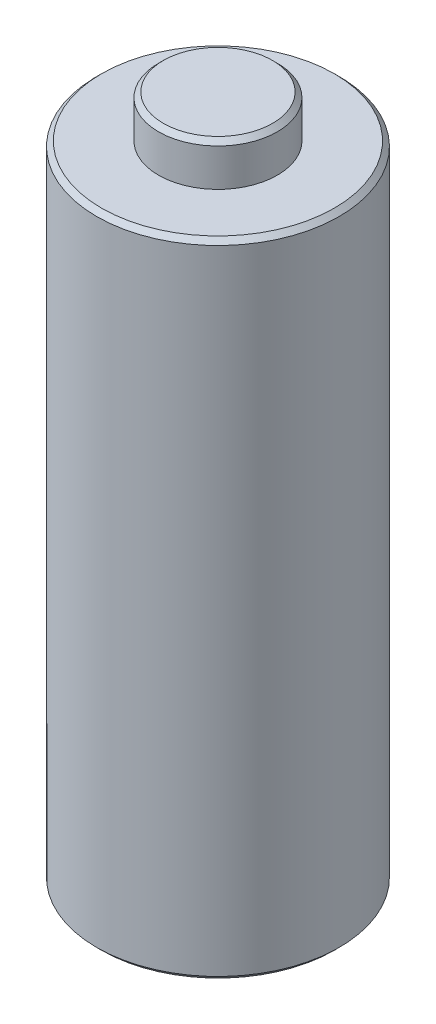
ISO-10303-21;
HEADER;
FILE_DESCRIPTION(('STEP AP214'),'2;1');
FILE_NAME('part.step','',(''),(''),'','','');
FILE_SCHEMA(('AUTOMOTIVE_DESIGN { 1 0 10303 214 1 1 1 1 }'));
ENDSEC;
DATA;
#1=APPLICATION_CONTEXT('core data for automotive mechanical design processes');
#2=APPLICATION_PROTOCOL_DEFINITION('international standard','automotive_design',2000,#1);
#3=PRODUCT_CONTEXT('',#1,'mechanical');
#4=PRODUCT('Part','Part','',(#3));
#5=PRODUCT_RELATED_PRODUCT_CATEGORY('part','',(#4));
#6=PRODUCT_DEFINITION_FORMATION('','',#4);
#7=PRODUCT_DEFINITION_CONTEXT('part definition',#1,'design');
#8=PRODUCT_DEFINITION('design','',#6,#7);
#9=PRODUCT_DEFINITION_SHAPE('','',#8);
#10=(LENGTH_UNIT() NAMED_UNIT(*) SI_UNIT(.MILLI.,.METRE.));
#11=(NAMED_UNIT(*) PLANE_ANGLE_UNIT() SI_UNIT($,.RADIAN.));
#12=(NAMED_UNIT(*) SI_UNIT($,.STERADIAN.) SOLID_ANGLE_UNIT());
#13=UNCERTAINTY_MEASURE_WITH_UNIT(LENGTH_MEASURE(1.E-05),#10,'distance_accuracy_value','');
#14=(GEOMETRIC_REPRESENTATION_CONTEXT(3) GLOBAL_UNCERTAINTY_ASSIGNED_CONTEXT((#13)) GLOBAL_UNIT_ASSIGNED_CONTEXT((#10,
#11,#12)) REPRESENTATION_CONTEXT('',''));
#15=CARTESIAN_POINT('',(0.,0.,0.));
#16=DIRECTION('',(0.,0.,1.));
#17=DIRECTION('',(1.,0.,0.));
#18=AXIS2_PLACEMENT_3D('',#15,#16,#17);
#19=CARTESIAN_POINT('',(0.,30.,0.));
#20=DIRECTION('',(0.,-1.,0.));
#21=DIRECTION('',(0.,0.,-1.));
#22=AXIS2_PLACEMENT_3D('',#19,#20,#21);
#23=CYLINDRICAL_SURFACE('',#22,2.45);
#24=CARTESIAN_POINT('',(0.,28.25,0.));
#25=DIRECTION('',(0.,1.,0.));
#26=DIRECTION('',(0.,0.,1.));
#27=AXIS2_PLACEMENT_3D('',#24,#25,#26);
#28=CIRCLE('',#27,2.45);
#29=CARTESIAN_POINT('',(0.,28.25,2.45));
#30=VERTEX_POINT('',#29);
#31=EDGE_CURVE('E62',#30,#30,#28,.T.);
#32=ORIENTED_EDGE('',*,*,#31,.T.);
#33=EDGE_LOOP('',(#32));
#34=FACE_BOUND('',#33,.T.);
#35=CARTESIAN_POINT('',(0.,29.8,0.));
#36=DIRECTION('',(0.,1.,0.));
#37=DIRECTION('',(0.,0.,1.));
#38=AXIS2_PLACEMENT_3D('',#35,#36,#37);
#39=CIRCLE('',#38,2.45);
#40=CARTESIAN_POINT('',(0.,29.8,2.45));
#41=VERTEX_POINT('',#40);
#42=EDGE_CURVE('E74',#41,#41,#39,.F.);
#43=ORIENTED_EDGE('',*,*,#42,.T.);
#44=EDGE_LOOP('',(#43));
#45=FACE_BOUND('',#44,.T.);
#46=ADVANCED_FACE('F43',(#34,#45),#23,.T.);
#47=CARTESIAN_POINT('',(0.,30.,0.));
#48=DIRECTION('',(0.,1.,0.));
#49=DIRECTION('',(0.,0.,1.));
#50=AXIS2_PLACEMENT_3D('',#47,#48,#49);
#51=PLANE('',#50);
#52=CARTESIAN_POINT('',(0.,30.,0.));
#53=DIRECTION('',(0.,1.,0.));
#54=DIRECTION('',(0.,0.,1.));
#55=AXIS2_PLACEMENT_3D('',#52,#53,#54);
#56=CIRCLE('',#55,2.25);
#57=CARTESIAN_POINT('',(0.,30.,2.25));
#58=VERTEX_POINT('',#57);
#59=EDGE_CURVE('E70',#58,#58,#56,.T.);
#60=ORIENTED_EDGE('',*,*,#59,.T.);
#61=EDGE_LOOP('',(#60));
#62=FACE_BOUND('',#61,.T.);
#63=ADVANCED_FACE('F85',(#62),#51,.T.);
#64=CARTESIAN_POINT('',(0.,30.,0.));
#65=DIRECTION('',(0.,-1.,0.));
#66=DIRECTION('',(0.,0.,-1.));
#67=AXIS2_PLACEMENT_3D('',#64,#65,#66);
#68=CONICAL_SURFACE('',#67,2.25,0.785398163397448);
#69=ORIENTED_EDGE('',*,*,#42,.F.);
#70=EDGE_LOOP('',(#69));
#71=FACE_BOUND('',#70,.T.);
#72=ORIENTED_EDGE('',*,*,#59,.F.);
#73=EDGE_LOOP('',(#72));
#74=FACE_BOUND('',#73,.T.);
#75=ADVANCED_FACE('F82',(#71,#74),#68,.T.);
#76=CARTESIAN_POINT('',(0.,28.25,0.));
#77=DIRECTION('',(0.,-1.,0.));
#78=DIRECTION('',(0.,0.,-1.));
#79=AXIS2_PLACEMENT_3D('',#76,#77,#78);
#80=CYLINDRICAL_SURFACE('',#79,5.);
#81=CARTESIAN_POINT('',(0.,1.95,0.));
#82=DIRECTION('',(0.,1.,0.));
#83=DIRECTION('',(0.,0.,1.));
#84=AXIS2_PLACEMENT_3D('',#81,#82,#83);
#85=CIRCLE('',#84,5.);
#86=CARTESIAN_POINT('',(0.,1.95,5.));
#87=VERTEX_POINT('',#86);
#88=EDGE_CURVE('E54',#87,#87,#85,.T.);
#89=ORIENTED_EDGE('',*,*,#88,.T.);
#90=EDGE_LOOP('',(#89));
#91=FACE_BOUND('',#90,.T.);
#92=CARTESIAN_POINT('',(0.,28.05,0.));
#93=DIRECTION('',(0.,1.,0.));
#94=DIRECTION('',(0.,0.,1.));
#95=AXIS2_PLACEMENT_3D('',#92,#93,#94);
#96=CIRCLE('',#95,5.);
#97=CARTESIAN_POINT('',(0.,28.05,5.));
#98=VERTEX_POINT('',#97);
#99=EDGE_CURVE('E56',#98,#98,#96,.F.);
#100=ORIENTED_EDGE('',*,*,#99,.T.);
#101=EDGE_LOOP('',(#100));
#102=FACE_BOUND('',#101,.T.);
#103=ADVANCED_FACE('F87',(#91,#102),#80,.T.);
#104=CARTESIAN_POINT('',(0.,28.25,0.));
#105=DIRECTION('',(0.,1.,0.));
#106=DIRECTION('',(0.,0.,1.));
#107=AXIS2_PLACEMENT_3D('',#104,#105,#106);
#108=PLANE('',#107);
#109=CARTESIAN_POINT('',(0.,28.25,0.));
#110=DIRECTION('',(0.,1.,0.));
#111=DIRECTION('',(0.,0.,1.));
#112=AXIS2_PLACEMENT_3D('',#109,#110,#111);
#113=CIRCLE('',#112,4.8);
#114=CARTESIAN_POINT('',(0.,28.25,4.8));
#115=VERTEX_POINT('',#114);
#116=EDGE_CURVE('E10',#115,#115,#113,.T.);
#117=ORIENTED_EDGE('',*,*,#116,.T.);
#118=EDGE_LOOP('',(#117));
#119=FACE_BOUND('',#118,.T.);
#120=ORIENTED_EDGE('',*,*,#31,.F.);
#121=EDGE_LOOP('',(#120));
#122=FACE_BOUND('',#121,.T.);
#123=ADVANCED_FACE('F92',(#119,#122),#108,.T.);
#124=CARTESIAN_POINT('',(0.,1.75,0.));
#125=DIRECTION('',(0.,1.,0.));
#126=DIRECTION('',(0.,0.,1.));
#127=AXIS2_PLACEMENT_3D('',#124,#125,#126);
#128=PLANE('',#127);
#129=CARTESIAN_POINT('',(0.,1.75,0.));
#130=DIRECTION('',(0.,1.,0.));
#131=DIRECTION('',(0.,0.,1.));
#132=AXIS2_PLACEMENT_3D('',#129,#130,#131);
#133=CIRCLE('',#132,4.8);
#134=CARTESIAN_POINT('',(0.,1.75,4.8));
#135=VERTEX_POINT('',#134);
#136=EDGE_CURVE('E51',#135,#135,#133,.F.);
#137=ORIENTED_EDGE('',*,*,#136,.T.);
#138=EDGE_LOOP('',(#137));
#139=FACE_BOUND('',#138,.T.);
#140=CARTESIAN_POINT('',(0.,1.75,0.));
#141=DIRECTION('',(0.,1.,0.));
#142=DIRECTION('',(0.,0.,1.));
#143=AXIS2_PLACEMENT_3D('',#140,#141,#142);
#144=CIRCLE('',#143,2.45);
#145=CARTESIAN_POINT('',(0.,1.75,2.45));
#146=VERTEX_POINT('',#145);
#147=EDGE_CURVE('E63',#146,#146,#144,.T.);
#148=ORIENTED_EDGE('',*,*,#147,.T.);
#149=EDGE_LOOP('',(#148));
#150=FACE_BOUND('',#149,.T.);
#151=ADVANCED_FACE('F127',(#139,#150),#128,.F.);
#152=CARTESIAN_POINT('',(0.,0.,0.));
#153=DIRECTION('',(0.,1.,0.));
#154=DIRECTION('',(0.,0.,1.));
#155=AXIS2_PLACEMENT_3D('',#152,#153,#154);
#156=PLANE('',#155);
#157=CARTESIAN_POINT('',(0.,0.,0.));
#158=DIRECTION('',(0.,1.,0.));
#159=DIRECTION('',(0.,0.,1.));
#160=AXIS2_PLACEMENT_3D('',#157,#158,#159);
#161=CIRCLE('',#160,2.25);
#162=CARTESIAN_POINT('',(0.,0.,2.25));
#163=VERTEX_POINT('',#162);
#164=EDGE_CURVE('E72',#163,#163,#161,.F.);
#165=ORIENTED_EDGE('',*,*,#164,.T.);
#166=EDGE_LOOP('',(#165));
#167=FACE_BOUND('',#166,.T.);
#168=ADVANCED_FACE('F117',(#167),#156,.F.);
#169=CARTESIAN_POINT('',(0.,0.199999999999999,0.));
#170=DIRECTION('',(0.,1.,0.));
#171=DIRECTION('',(0.,0.,1.));
#172=AXIS2_PLACEMENT_3D('',#169,#170,#171);
#173=CONICAL_SURFACE('',#172,2.45,0.785398163397448);
#174=ORIENTED_EDGE('',*,*,#164,.F.);
#175=EDGE_LOOP('',(#174));
#176=FACE_BOUND('',#175,.T.);
#177=CARTESIAN_POINT('',(0.,0.199999999999999,0.));
#178=DIRECTION('',(0.,1.,0.));
#179=DIRECTION('',(0.,0.,1.));
#180=AXIS2_PLACEMENT_3D('',#177,#178,#179);
#181=CIRCLE('',#180,2.45);
#182=CARTESIAN_POINT('',(0.,0.199999999999999,2.45));
#183=VERTEX_POINT('',#182);
#184=EDGE_CURVE('E76',#183,#183,#181,.T.);
#185=ORIENTED_EDGE('',*,*,#184,.F.);
#186=EDGE_LOOP('',(#185));
#187=FACE_BOUND('',#186,.T.);
#188=ADVANCED_FACE('F114',(#176,#187),#173,.T.);
#189=ORIENTED_EDGE('',*,*,#184,.T.);
#190=EDGE_LOOP('',(#189));
#191=FACE_BOUND('',#190,.T.);
#192=ORIENTED_EDGE('',*,*,#147,.F.);
#193=EDGE_LOOP('',(#192));
#194=FACE_BOUND('',#193,.T.);
#195=ADVANCED_FACE('F106',(#191,#194),#23,.T.);
#196=CARTESIAN_POINT('',(0.,1.95,0.));
#197=DIRECTION('',(0.,1.,0.));
#198=DIRECTION('',(0.,0.,1.));
#199=AXIS2_PLACEMENT_3D('',#196,#197,#198);
#200=CONICAL_SURFACE('',#199,5.,0.785398163397455);
#201=ORIENTED_EDGE('',*,*,#136,.F.);
#202=EDGE_LOOP('',(#201));
#203=FACE_BOUND('',#202,.T.);
#204=ORIENTED_EDGE('',*,*,#88,.F.);
#205=EDGE_LOOP('',(#204));
#206=FACE_BOUND('',#205,.T.);
#207=ADVANCED_FACE('F115',(#203,#206),#200,.T.);
#208=CARTESIAN_POINT('',(0.,28.25,0.));
#209=DIRECTION('',(0.,-1.,0.));
#210=DIRECTION('',(0.,0.,-1.));
#211=AXIS2_PLACEMENT_3D('',#208,#209,#210);
#212=CONICAL_SURFACE('',#211,4.8,0.785398163397463);
#213=ORIENTED_EDGE('',*,*,#99,.F.);
#214=EDGE_LOOP('',(#213));
#215=FACE_BOUND('',#214,.T.);
#216=ORIENTED_EDGE('',*,*,#116,.F.);
#217=EDGE_LOOP('',(#216));
#218=FACE_BOUND('',#217,.T.);
#219=ADVANCED_FACE('F46',(#215,#218),#212,.T.);
#220=CLOSED_SHELL('',(#46,#63,#75,#103,#123,#151,#168,#188,#195,#207,#219));
#221=MANIFOLD_SOLID_BREP('B2',#220);
#222=ADVANCED_BREP_SHAPE_REPRESENTATION('',(#18,#221),#14);
#223=SHAPE_DEFINITION_REPRESENTATION(#9,#222);
ENDSEC;
END-ISO-10303-21;
